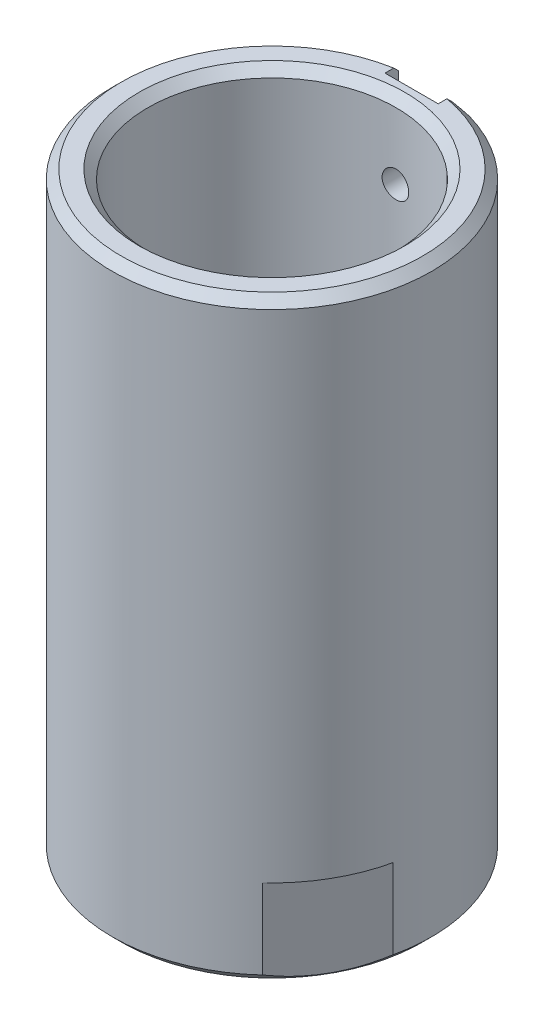
ISO-10303-21;
HEADER;
FILE_DESCRIPTION(('STEP AP214'),'2;1');
FILE_NAME('part.step','',(''),(''),'','','');
FILE_SCHEMA(('AUTOMOTIVE_DESIGN { 1 0 10303 214 1 1 1 1 }'));
ENDSEC;
DATA;
#1=APPLICATION_CONTEXT('core data for automotive mechanical design processes');
#2=APPLICATION_PROTOCOL_DEFINITION('international standard','automotive_design',2000,#1);
#3=PRODUCT_CONTEXT('',#1,'mechanical');
#4=PRODUCT('Part','Part','',(#3));
#5=PRODUCT_RELATED_PRODUCT_CATEGORY('part','',(#4));
#6=PRODUCT_DEFINITION_FORMATION('','',#4);
#7=PRODUCT_DEFINITION_CONTEXT('part definition',#1,'design');
#8=PRODUCT_DEFINITION('design','',#6,#7);
#9=PRODUCT_DEFINITION_SHAPE('','',#8);
#10=(LENGTH_UNIT() NAMED_UNIT(*) SI_UNIT(.MILLI.,.METRE.));
#11=(NAMED_UNIT(*) PLANE_ANGLE_UNIT() SI_UNIT($,.RADIAN.));
#12=(NAMED_UNIT(*) SI_UNIT($,.STERADIAN.) SOLID_ANGLE_UNIT());
#13=UNCERTAINTY_MEASURE_WITH_UNIT(LENGTH_MEASURE(1.E-05),#10,'distance_accuracy_value','');
#14=(GEOMETRIC_REPRESENTATION_CONTEXT(3) GLOBAL_UNCERTAINTY_ASSIGNED_CONTEXT((#13)) GLOBAL_UNIT_ASSIGNED_CONTEXT((#10,
#11,#12)) REPRESENTATION_CONTEXT('',''));
#15=CARTESIAN_POINT('',(0.,0.,0.));
#16=DIRECTION('',(0.,0.,1.));
#17=DIRECTION('',(1.,0.,0.));
#18=AXIS2_PLACEMENT_3D('',#15,#16,#17);
#19=CARTESIAN_POINT('',(0.,33.5,0.));
#20=DIRECTION('',(0.,-1.,0.));
#21=DIRECTION('',(0.,0.,-1.));
#22=AXIS2_PLACEMENT_3D('',#19,#20,#21);
#23=CYLINDRICAL_SURFACE('',#22,7.);
#24=CARTESIAN_POINT('',(0.,0.5,0.));
#25=DIRECTION('',(0.,1.,0.));
#26=DIRECTION('',(0.,0.,1.));
#27=AXIS2_PLACEMENT_3D('',#24,#25,#26);
#28=CIRCLE('',#27,7.);
#29=CARTESIAN_POINT('',(0.,0.5,7.));
#30=VERTEX_POINT('',#29);
#31=EDGE_CURVE('E11',#30,#30,#28,.F.);
#32=ORIENTED_EDGE('',*,*,#31,.T.);
#33=EDGE_LOOP('',(#32));
#34=FACE_BOUND('',#33,.T.);
#35=CARTESIAN_POINT('',(0.,33.,0.));
#36=DIRECTION('',(0.,1.,0.));
#37=DIRECTION('',(0.,0.,1.));
#38=AXIS2_PLACEMENT_3D('',#35,#36,#37);
#39=CIRCLE('',#38,7.);
#40=CARTESIAN_POINT('',(0.,33.,7.));
#41=VERTEX_POINT('',#40);
#42=EDGE_CURVE('E511',#41,#41,#39,.T.);
#43=ORIENTED_EDGE('',*,*,#42,.T.);
#44=EDGE_LOOP('',(#43));
#45=FACE_BOUND('',#44,.T.);
#46=CARTESIAN_POINT('',(-0.750000000000001,29.25,-6.95970545353753));
#47=CARTESIAN_POINT('',(-0.749998188954248,29.2919979041359,-6.95970597860892));
#48=CARTESIAN_POINT('',(-0.746460465229947,29.3340231781121,-6.96008970314285));
#49=CARTESIAN_POINT('',(-0.732401884499363,29.4169074031208,-6.96158283156598));
#50=CARTESIAN_POINT('',(-0.721873436693954,29.4577650359268,-6.96269302426344));
#51=CARTESIAN_POINT('',(-0.694144521638661,29.5371017574607,-6.96551192623545));
#52=CARTESIAN_POINT('',(-0.676948226374381,29.5755823160738,-6.96722026119542));
#53=CARTESIAN_POINT('',(-0.636380026781787,29.649103063514,-6.97104250359877));
#54=CARTESIAN_POINT('',(-0.61300930385036,29.6841439087284,-6.97315633343478));
#55=CARTESIAN_POINT('',(-0.560651516289507,29.7499440435217,-6.97756122064666));
#56=CARTESIAN_POINT('',(-0.531644005513801,29.780687023625,-6.97985290439945));
#57=CARTESIAN_POINT('',(-0.468879862660795,29.8368781821779,-6.98434961455859));
#58=CARTESIAN_POINT('',(-0.435123008538541,29.8623261129314,-6.98655463690711));
#59=CARTESIAN_POINT('',(-0.36371768837328,29.9072618323478,-6.99063583682212));
#60=CARTESIAN_POINT('',(-0.326060025221558,29.9267350857939,-6.99251120775583));
#61=CARTESIAN_POINT('',(-0.24798576688226,29.9590756619544,-6.99571496388661));
#62=CARTESIAN_POINT('',(-0.207569248194761,29.9719431677549,-6.99704336424341));
#63=CARTESIAN_POINT('',(-0.125290011100524,29.990658876596,-6.99899910301927));
#64=CARTESIAN_POINT('',(-0.0834334752072009,29.9965339745234,-6.99962912695603));
#65=CARTESIAN_POINT('',(0.000675925573989573,30.0011813482214,-7.00012627047899));
#66=CARTESIAN_POINT('',(0.0429287787469273,29.999953833285,-6.99999341254507));
#67=CARTESIAN_POINT('',(0.126448727987235,29.9904525841851,-6.99898195296535));
#68=CARTESIAN_POINT('',(0.167719156381502,29.982207771119,-6.99810641226255));
#69=CARTESIAN_POINT('',(0.248287115800397,29.9589510617331,-6.99571146499121));
#70=CARTESIAN_POINT('',(0.287584617971626,29.9439390664775,-6.99419204900929));
#71=CARTESIAN_POINT('',(0.3631819480879,29.907542669899,-6.99067487523425));
#72=CARTESIAN_POINT('',(0.399475604124605,29.8861455450597,-6.98867616393591));
#73=CARTESIAN_POINT('',(0.467967657190985,29.8375955175866,-6.98442450088663));
#74=CARTESIAN_POINT('',(0.500165916179861,29.8104424210222,-6.98217154057073));
#75=CARTESIAN_POINT('',(0.559722717920771,29.7509887482116,-6.97765066911835));
#76=CARTESIAN_POINT('',(0.587056137708157,29.7186630006095,-6.97538273972832));
#77=CARTESIAN_POINT('',(0.635912666329555,29.6498686938903,-6.9710987988514));
#78=CARTESIAN_POINT('',(0.657435764553122,29.613400127208,-6.96908278782456));
#79=CARTESIAN_POINT('',(0.694060974626845,29.537335275289,-6.96553082593988));
#80=CARTESIAN_POINT('',(0.70916141360807,29.4977381783647,-6.9639950001804));
#81=CARTESIAN_POINT('',(0.732492150200906,29.4165503707976,-6.96157985347851));
#82=CARTESIAN_POINT('',(0.740722688852523,29.3749597301552,-6.96070050950265));
#83=CARTESIAN_POINT('',(0.750047422819167,29.2911863431268,-6.95970194411217));
#84=CARTESIAN_POINT('',(0.751176819948078,29.249007557926,-6.95957897326707));
#85=CARTESIAN_POINT('',(0.746359773218079,29.1650613526495,-6.9600971779777));
#86=CARTESIAN_POINT('',(0.74041343940178,29.1232939261867,-6.96073834164951));
#87=CARTESIAN_POINT('',(0.721643227017531,29.041459427122,-6.96270915923294));
#88=CARTESIAN_POINT('',(0.708836098549062,29.0013884687393,-6.96403713607158));
#89=CARTESIAN_POINT('',(0.676724981403666,28.9239633834986,-6.96723059145024));
#90=CARTESIAN_POINT('',(0.657420822683684,28.8866093277797,-6.96909608405817));
#91=CARTESIAN_POINT('',(0.612775866425896,28.8155182527604,-6.97316343023226));
#92=CARTESIAN_POINT('',(0.587411805801567,28.7817959172283,-6.97536656798713));
#93=CARTESIAN_POINT('',(0.531400260034387,28.7190746810697,-6.97985681117932));
#94=CARTESIAN_POINT('',(0.500752624575668,28.6900759148728,-6.98214391900411));
#95=CARTESIAN_POINT('',(0.434890907409626,28.6375029958028,-6.98655577647023));
#96=CARTESIAN_POINT('',(0.399658405177615,28.6139518513553,-6.98867981303623));
#97=CARTESIAN_POINT('',(0.325717687806027,28.5731012633023,-6.99251575545415));
#98=CARTESIAN_POINT('',(0.287009526368538,28.5558017231245,-6.99422766767225));
#99=CARTESIAN_POINT('',(0.207295567840504,28.5279841400164,-6.99704327123349));
#100=CARTESIAN_POINT('',(0.166294610181288,28.5174523589679,-6.99814819405997));
#101=CARTESIAN_POINT('',(0.0830938249674433,28.5034244519696,-6.9996303942933));
#102=CARTESIAN_POINT('',(0.0408940364943885,28.499928096933,-7.00000769539287));
#103=CARTESIAN_POINT('',(-0.043280877437141,28.5000737874612,-6.99999210266533));
#104=CARTESIAN_POINT('',(-0.0852560698495304,28.5036801793169,-6.99960305567955));
#105=CARTESIAN_POINT('',(-0.168000531751268,28.5178540301605,-6.99810608166936));
#106=CARTESIAN_POINT('',(-0.208769800700631,28.5284214922654,-6.99699815432306));
#107=CARTESIAN_POINT('',(-0.287943667160063,28.5562072734386,-6.99418748987409));
#108=CARTESIAN_POINT('',(-0.326348698129789,28.5734243691265,-6.99248486218816));
#109=CARTESIAN_POINT('',(-0.399729595385497,28.6140169420195,-6.98867425687213));
#110=CARTESIAN_POINT('',(-0.43470546547284,28.6373924123976,-6.98656627969138));
#111=CARTESIAN_POINT('',(-0.500417838535548,28.6897715174072,-6.98216825318622));
#112=CARTESIAN_POINT('',(-0.531133112197557,28.7188017166406,-6.97987737584868));
#113=CARTESIAN_POINT('',(-0.587271454076921,28.7816127561913,-6.97537866721102));
#114=CARTESIAN_POINT('',(-0.612693255454977,28.8153947304746,-6.97317085589368));
#115=CARTESIAN_POINT('',(-0.657582396293361,28.8868585760036,-6.96908146510482));
#116=CARTESIAN_POINT('',(-0.677032379556264,28.9245513966185,-6.96720084329839));
#117=CARTESIAN_POINT('',(-0.709300514000938,29.0026649489938,-6.96399010067246));
#118=CARTESIAN_POINT('',(-0.722126075368956,29.0430825752524,-6.9626593650761));
#119=CARTESIAN_POINT('',(-0.737616363484706,29.1114367554021,-6.961031400962));
#120=CARTESIAN_POINT('',(-0.742253794730779,29.1389377265766,-6.9605365545351));
#121=CARTESIAN_POINT('',(-0.748446205999602,29.1942884510694,-6.95987340747221));
#122=CARTESIAN_POINT('',(-0.750001201464475,29.2221382026397,-6.95970510520032));
#123=CARTESIAN_POINT('',(-0.750000000000001,29.25,-6.95970545353753));
#124=B_SPLINE_CURVE_WITH_KNOTS('',3,(#46,#47,#48,#49,#50,#51,#52,#53,#54,#55,#56,#57,#58,#59,
#60,#61,#62,#63,#64,#65,#66,#67,#68,#69,#70,#71,#72,#73,#74,#75,#76,#77,#78,#79,#80,#81,#82,#83,
#84,#85,#86,#87,#88,#89,#90,#91,#92,#93,#94,#95,#96,#97,#98,#99,#100,#101,#102,#103,#104,#105,
#106,#107,#108,#109,#110,#111,#112,#113,#114,#115,#116,#117,#118,#119,#120,#121,#122,#123),
.UNSPECIFIED.,.T.,.F.,(4,2,2,2,2,2,2,2,2,2,2,2,2,2,2,2,2,2,2,2,2,2,2,2,2,2,2,2,2,2,2,2,2,2,2,2,
2,2,4),(0.,0.125891956665267,0.251920835733632,0.377870987081191,0.503797056927248,
0.630188720738995,0.756586295675875,0.883288976463161,1.00998814534838,1.13619840010579,
1.26240493583866,1.38809382867333,1.51378455913157,1.63972744269348,1.76567457020331,
1.89225434698756,2.0188343549223,2.14544731218131,2.27205582686193,2.39803621910148,
2.52401465210455,2.64968691094277,2.77536245918493,2.90152843695946,3.02769800470471,
3.1543911059818,3.28108225007225,3.40751539999475,3.53394443294853,3.65974044657153,
3.78553651652238,3.91130945389492,4.03708225184162,4.16346080720354,4.28986957293918,
4.41664232316294,4.54327295451181,4.6267912592976,4.71030914567944),.UNSPECIFIED.);
#125=CARTESIAN_POINT('',(-0.750000000000001,29.25,-6.95970545353753));
#126=VERTEX_POINT('',#125);
#127=EDGE_CURVE('E138',#126,#126,#124,.T.);
#128=ORIENTED_EDGE('',*,*,#127,.T.);
#129=EDGE_LOOP('',(#128));
#130=FACE_BOUND('',#129,.T.);
#131=CARTESIAN_POINT('',(-5.5,2.5,4.33012701892219));
#132=CARTESIAN_POINT('',(-5.50000194275706,2.44413791438435,4.33012545079125));
#133=CARTESIAN_POINT('',(-5.50293977358478,2.38824264362741,4.32640104199753));
#134=CARTESIAN_POINT('',(-5.51456200770678,2.278012681801,4.31157641361144));
#135=CARTESIAN_POINT('',(-5.52325213760261,2.22367960224494,4.30046884379515));
#136=CARTESIAN_POINT('',(-5.54596945799242,2.11818564998112,4.27113154765873));
#137=CARTESIAN_POINT('',(-5.55999269664827,2.06702246094855,4.2529070946873));
#138=CARTESIAN_POINT('',(-5.5927485085935,1.96925513526716,4.20973809522395));
#139=CARTESIAN_POINT('',(-5.61148038613033,1.92265032648017,4.18479454151317));
#140=CARTESIAN_POINT('',(-5.65299474427765,1.83497585207601,4.12854414052465));
#141=CARTESIAN_POINT('',(-5.67580276804278,1.79394414306697,4.0971969767312));
#142=CARTESIAN_POINT('',(-5.72445759580941,1.71890922137979,4.02893762947487));
#143=CARTESIAN_POINT('',(-5.75030456181793,1.68490638367988,3.99202514929349));
#144=CARTESIAN_POINT('',(-5.80415549414252,1.62475545112013,3.91331815934242));
#145=CARTESIAN_POINT('',(-5.83216834837752,1.59864214274078,3.87150312524937));
#146=CARTESIAN_POINT('',(-5.88921637392223,1.55523463233609,3.78415753812966));
#147=CARTESIAN_POINT('',(-5.91825149605228,1.5379400066763,3.73862716370351));
#148=CARTESIAN_POINT('',(-5.97613903078911,1.51277539651786,3.64537406566751));
#149=CARTESIAN_POINT('',(-6.00499133955338,1.50484196501688,3.59766840406352));
#150=CARTESIAN_POINT('',(-6.06179940530634,1.4984280507167,3.50110339955694));
#151=CARTESIAN_POINT('',(-6.08975520764356,1.49994708901694,3.45224411522651));
#152=CARTESIAN_POINT('',(-6.14378230791832,1.51234468910791,3.35514598667531));
#153=CARTESIAN_POINT('',(-6.16986584872934,1.52315499944125,3.30690521544099));
#154=CARTESIAN_POINT('',(-6.21974643087186,1.5537212798496,3.2121060256611));
#155=CARTESIAN_POINT('',(-6.24354341785463,1.5734774624939,3.16554764712046));
#156=CARTESIAN_POINT('',(-6.28845921450289,1.62144537239178,3.07535854286614));
#157=CARTESIAN_POINT('',(-6.30956848773945,1.64968607555942,3.03173848711685));
#158=CARTESIAN_POINT('',(-6.34868751016331,1.71380024637013,2.94894333798147));
#159=CARTESIAN_POINT('',(-6.36669707393575,1.74967417032161,2.90976851054267));
#160=CARTESIAN_POINT('',(-6.3995577498915,1.82841730083799,2.8367728806548));
#161=CARTESIAN_POINT('',(-6.41437924729288,1.87134606637459,2.80300296778562));
#162=CARTESIAN_POINT('',(-6.44053937358176,1.96277726071474,2.7423615155652));
#163=CARTESIAN_POINT('',(-6.45187798462503,2.01127971807281,2.71549001155741));
#164=CARTESIAN_POINT('',(-6.4710195291785,2.11254014495309,2.66955593552164));
#165=CARTESIAN_POINT('',(-6.47882012339291,2.1653009029413,2.65049853088248));
#166=CARTESIAN_POINT('',(-6.49084820744127,2.27354878991294,2.62090577858383));
#167=CARTESIAN_POINT('',(-6.49507592461071,2.32903574519578,2.61036988871811));
#168=CARTESIAN_POINT('',(-6.49992840678571,2.44063826871502,2.59826356146011));
#169=CARTESIAN_POINT('',(-6.50058453993285,2.49674401299779,2.59661506997062));
#170=CARTESIAN_POINT('',(-6.49837710210849,2.60844890251257,2.60213441773304));
#171=CARTESIAN_POINT('',(-6.49551362987185,2.66404806191164,2.60930200966892));
#172=CARTESIAN_POINT('',(-6.48629350426331,2.77290609001422,2.63213706306361));
#173=CARTESIAN_POINT('',(-6.47995262702475,2.82617436353267,2.64776613280622));
#174=CARTESIAN_POINT('',(-6.46380550144923,2.92915439872825,2.68694337336841));
#175=CARTESIAN_POINT('',(-6.45399909672264,2.97886599978086,2.71049190156885));
#176=CARTESIAN_POINT('',(-6.43088330929899,3.07369593986074,2.76488985488164));
#177=CARTESIAN_POINT('',(-6.4175503901659,3.11878048060618,2.79578818862222));
#178=CARTESIAN_POINT('',(-6.38750224044282,3.20272986181275,2.86377249475225));
#179=CARTESIAN_POINT('',(-6.37078683688862,3.24159438402956,2.90085878354735));
#180=CARTESIAN_POINT('',(-6.33400032440684,3.3122976092169,2.9803301471087));
#181=CARTESIAN_POINT('',(-6.31390491806205,3.34408126115976,3.02275298337605));
#182=CARTESIAN_POINT('',(-6.27072976339902,3.39933778156786,3.11132966485657));
#183=CARTESIAN_POINT('',(-6.24765009045142,3.42281085986897,3.15748341583073));
#184=CARTESIAN_POINT('',(-6.19901542615673,3.46069105715786,3.25192510343772));
#185=CARTESIAN_POINT('',(-6.17346913698096,3.47512879431374,3.3002052323628));
#186=CARTESIAN_POINT('',(-6.12042039261016,3.4946277335533,3.39757650748381));
#187=CARTESIAN_POINT('',(-6.09291805419781,3.49968949492692,3.44666760512805));
#188=CARTESIAN_POINT('',(-6.03695171807081,3.50028011947223,3.5437729781803));
#189=CARTESIAN_POINT('',(-6.00849845528105,3.49589340950922,3.59179294847806));
#190=CARTESIAN_POINT('',(-5.95125678692636,3.47789192497848,3.68586151890487));
#191=CARTESIAN_POINT('',(-5.92246838215287,3.46427717219806,3.73191012368802));
#192=CARTESIAN_POINT('',(-5.86552121751137,3.4282350112859,3.82079145893961));
#193=CARTESIAN_POINT('',(-5.83736208926935,3.40581290975763,3.86362610740575));
#194=CARTESIAN_POINT('',(-5.78264436844424,3.35280142539899,3.94505175277544));
#195=CARTESIAN_POINT('',(-5.75608581803626,3.32221182747094,3.98364263787823));
#196=CARTESIAN_POINT('',(-5.70534044620681,3.25342614238831,4.05599094732681));
#197=CARTESIAN_POINT('',(-5.68117572867416,3.21516754658375,4.08970444979993));
#198=CARTESIAN_POINT('',(-5.63643532647144,3.13226121988235,4.1511498752371));
#199=CARTESIAN_POINT('',(-5.61586048720839,3.08761198850172,4.17888038958571));
#200=CARTESIAN_POINT('',(-5.57907864510288,2.99292728083219,4.22786320577816));
#201=CARTESIAN_POINT('',(-5.56289430603893,2.94286565479448,4.24908196508331));
#202=CARTESIAN_POINT('',(-5.53577064178122,2.83898385169769,4.28436027074053));
#203=CARTESIAN_POINT('',(-5.52482579408387,2.78516770084123,4.29842735603999));
#204=CARTESIAN_POINT('',(-5.51120534534633,2.69258178708485,4.31586525310683));
#205=CARTESIAN_POINT('',(-5.50701274353545,2.6543878322951,4.32120717020786));
#206=CARTESIAN_POINT('',(-5.50140941272048,2.5774679015167,4.32833857704697));
#207=CARTESIAN_POINT('',(-5.49999865264321,2.53874193147553,4.33012810646522));
#208=CARTESIAN_POINT('',(-5.5,2.5,4.33012701892219));
#209=B_SPLINE_CURVE_WITH_KNOTS('',3,(#131,#132,#133,#134,#135,#136,#137,#138,#139,#140,#141,
#142,#143,#144,#145,#146,#147,#148,#149,#150,#151,#152,#153,#154,#155,#156,#157,#158,#159,#160,
#161,#162,#163,#164,#165,#166,#167,#168,#169,#170,#171,#172,#173,#174,#175,#176,#177,#178,#179,
#180,#181,#182,#183,#184,#185,#186,#187,#188,#189,#190,#191,#192,#193,#194,#195,#196,#197,#198,
#199,#200,#201,#202,#203,#204,#205,#206,#207,#208),.UNSPECIFIED.,.T.,.F.,(4,2,2,2,2,2,2,2,2,2,2,
2,2,2,2,2,2,2,2,2,2,2,2,2,2,2,2,2,2,2,2,2,2,2,2,2,2,2,4),(0.,0.167444674697946,0.33505629725044,
0.502543960684092,0.670006890528837,0.838558578232397,1.00711925555999,1.17641265336732,
1.3456979178424,1.51382911068039,1.6819517853778,1.84884992452451,2.01575202966586,
2.18323073819423,2.3507194612925,2.51970258991851,2.68868658429869,2.85778214664265,
3.02686694894168,3.1944643054001,3.36205696038683,3.52889550400879,3.69574157755292,
3.86373060504461,4.0317282248703,4.20098960759813,4.37024671629559,4.53892711068184,
4.70759744272481,4.87476687650763,5.0419359156068,5.20900438614292,5.37607725699724,
5.54457174653061,5.71310586267878,5.88249407755997,6.05170335943179,6.1678322598134,
6.28395986302758),.UNSPECIFIED.);
#210=CARTESIAN_POINT('',(-5.5,2.5,4.33012701892219));
#211=VERTEX_POINT('',#210);
#212=EDGE_CURVE('E184',#211,#211,#209,.T.);
#213=ORIENTED_EDGE('',*,*,#212,.F.);
#214=EDGE_LOOP('',(#213));
#215=FACE_BOUND('',#214,.T.);
#216=ADVANCED_FACE('F33',(#34,#45,#130,#215),#23,.F.);
#217=CARTESIAN_POINT('',(0.,33.5,0.));
#218=DIRECTION('',(0.,1.,0.));
#219=DIRECTION('',(0.,0.,1.));
#220=AXIS2_PLACEMENT_3D('',#217,#218,#219);
#221=PLANE('',#220);
#222=CARTESIAN_POINT('',(0.,33.5,0.));
#223=DIRECTION('',(0.,1.,0.));
#224=DIRECTION('',(0.,0.,1.));
#225=AXIS2_PLACEMENT_3D('',#222,#223,#224);
#226=CIRCLE('',#225,7.50000000000001);
#227=CARTESIAN_POINT('',(0.,33.5,7.50000000000001));
#228=VERTEX_POINT('',#227);
#229=EDGE_CURVE('E219',#228,#228,#226,.F.);
#230=ORIENTED_EDGE('',*,*,#229,.T.);
#231=EDGE_LOOP('',(#230));
#232=FACE_BOUND('',#231,.T.);
#233=DIRECTION('',(0.,0.,1.));
#234=VECTOR('',#233,1.);
#235=CARTESIAN_POINT('',(-1.5,33.5,-8.87411967464942));
#236=LINE('',#235,#234);
#237=CARTESIAN_POINT('',(-1.5,33.5,-8.36660026534075));
#238=VERTEX_POINT('',#237);
#239=CARTESIAN_POINT('',(-1.5,33.5,-7.87411967464942));
#240=VERTEX_POINT('',#239);
#241=EDGE_CURVE('E173',#238,#240,#236,.T.);
#242=ORIENTED_EDGE('',*,*,#241,.F.);
#243=CARTESIAN_POINT('',(0.,33.5,0.));
#244=DIRECTION('',(0.,1.,0.));
#245=DIRECTION('',(0.,0.,1.));
#246=AXIS2_PLACEMENT_3D('',#243,#244,#245);
#247=CIRCLE('',#246,8.5);
#248=CARTESIAN_POINT('',(1.5,33.5,-8.36660026534075));
#249=VERTEX_POINT('',#248);
#250=EDGE_CURVE('E524',#238,#249,#247,.T.);
#251=ORIENTED_EDGE('',*,*,#250,.T.);
#252=DIRECTION('',(0.,0.,-1.));
#253=VECTOR('',#252,1.);
#254=CARTESIAN_POINT('',(1.5,33.5,-8.87411967464942));
#255=LINE('',#254,#253);
#256=CARTESIAN_POINT('',(1.5,33.5,-7.87411967464942));
#257=VERTEX_POINT('',#256);
#258=EDGE_CURVE('E160',#257,#249,#255,.T.);
#259=ORIENTED_EDGE('',*,*,#258,.F.);
#260=DIRECTION('',(1.,0.,0.));
#261=VECTOR('',#260,1.);
#262=CARTESIAN_POINT('',(-1.5,33.5,-7.87411967464942));
#263=LINE('',#262,#261);
#264=EDGE_CURVE('E165',#240,#257,#263,.T.);
#265=ORIENTED_EDGE('',*,*,#264,.F.);
#266=EDGE_LOOP('',(#242,#251,#259,#265));
#267=FACE_BOUND('',#266,.T.);
#268=ADVANCED_FACE('F267',(#232,#267),#221,.T.);
#269=CARTESIAN_POINT('',(0.,0.,0.));
#270=DIRECTION('',(0.,1.,0.));
#271=DIRECTION('',(0.,0.,1.));
#272=AXIS2_PLACEMENT_3D('',#269,#270,#271);
#273=PLANE('',#272);
#274=CARTESIAN_POINT('',(0.,0.,0.));
#275=DIRECTION('',(0.,1.,0.));
#276=DIRECTION('',(0.,0.,1.));
#277=AXIS2_PLACEMENT_3D('',#274,#275,#276);
#278=CIRCLE('',#277,7.5);
#279=CARTESIAN_POINT('',(0.,0.,7.5));
#280=VERTEX_POINT('',#279);
#281=EDGE_CURVE('E41',#280,#280,#278,.T.);
#282=ORIENTED_EDGE('',*,*,#281,.T.);
#283=EDGE_LOOP('',(#282));
#284=FACE_BOUND('',#283,.T.);
#285=CARTESIAN_POINT('',(0.,0.,0.));
#286=DIRECTION('',(0.,1.,0.));
#287=DIRECTION('',(0.,0.,1.));
#288=AXIS2_PLACEMENT_3D('',#285,#286,#287);
#289=CIRCLE('',#288,8.5);
#290=CARTESIAN_POINT('',(8.29715244778978,0.,1.8458768263717));
#291=VERTEX_POINT('',#290);
#292=EDGE_CURVE('E46',#291,#291,#289,.F.);
#293=ORIENTED_EDGE('',*,*,#292,.T.);
#294=EDGE_LOOP('',(#293));
#295=FACE_BOUND('',#294,.T.);
#296=ADVANCED_FACE('F275',(#284,#295),#273,.F.);
#297=CARTESIAN_POINT('',(0.,33.5,0.));
#298=DIRECTION('',(0.,-1.,0.));
#299=DIRECTION('',(0.,0.,-1.));
#300=AXIS2_PLACEMENT_3D('',#297,#298,#299);
#301=CYLINDRICAL_SURFACE('',#300,9.);
#302=DIRECTION('',(0.,1.,0.));
#303=VECTOR('',#302,1.);
#304=CARTESIAN_POINT('',(2.5,28.,-8.64580823289529));
#305=LINE('',#304,#303);
#306=CARTESIAN_POINT('',(2.5,28.,-8.64580823289529));
#307=VERTEX_POINT('',#306);
#308=CARTESIAN_POINT('',(2.5,33.,-8.64580823289529));
#309=VERTEX_POINT('',#308);
#310=EDGE_CURVE('E146',#307,#309,#305,.T.);
#311=ORIENTED_EDGE('',*,*,#310,.T.);
#312=CARTESIAN_POINT('',(0.,33.,0.));
#313=DIRECTION('',(0.,1.,0.));
#314=DIRECTION('',(0.,0.,1.));
#315=AXIS2_PLACEMENT_3D('',#312,#313,#314);
#316=CIRCLE('',#315,9.);
#317=CARTESIAN_POINT('',(-2.5,33.,-8.64580823289529));
#318=VERTEX_POINT('',#317);
#319=EDGE_CURVE('E151',#309,#318,#316,.F.);
#320=ORIENTED_EDGE('',*,*,#319,.T.);
#321=DIRECTION('',(0.,1.,0.));
#322=VECTOR('',#321,1.);
#323=CARTESIAN_POINT('',(-2.5,28.,-8.64580823289529));
#324=LINE('',#323,#322);
#325=CARTESIAN_POINT('',(-2.5,28.,-8.64580823289529));
#326=VERTEX_POINT('',#325);
#327=EDGE_CURVE('E144',#326,#318,#324,.T.);
#328=ORIENTED_EDGE('',*,*,#327,.F.);
#329=CARTESIAN_POINT('',(0.,28.,0.));
#330=DIRECTION('',(0.,1.,0.));
#331=DIRECTION('',(0.,0.,1.));
#332=AXIS2_PLACEMENT_3D('',#329,#330,#331);
#333=CIRCLE('',#332,9.);
#334=EDGE_CURVE('E131',#307,#326,#333,.T.);
#335=ORIENTED_EDGE('',*,*,#334,.F.);
#336=EDGE_LOOP('',(#311,#320,#328,#335));
#337=FACE_BOUND('',#336,.T.);
#338=DIRECTION('',(0.,-1.,0.));
#339=VECTOR('',#338,1.);
#340=CARTESIAN_POINT('',(8.78522023883624,5.,1.95445781615828));
#341=LINE('',#340,#339);
#342=CARTESIAN_POINT('',(8.78522023883624,5.,1.95445781615828));
#343=VERTEX_POINT('',#342);
#344=CARTESIAN_POINT('',(8.78522023883624,0.499999999999973,1.95445781615828));
#345=VERTEX_POINT('',#344);
#346=EDGE_CURVE('E307',#343,#345,#341,.T.);
#347=ORIENTED_EDGE('',*,*,#346,.T.);
#348=CARTESIAN_POINT('',(0.,0.5,0.));
#349=DIRECTION('',(0.,1.,0.));
#350=DIRECTION('',(0.,0.,1.));
#351=AXIS2_PLACEMENT_3D('',#348,#349,#350);
#352=CIRCLE('',#351,9.);
#353=CARTESIAN_POINT('',(2.7,0.500000000000002,-8.58545281275251));
#354=VERTEX_POINT('',#353);
#355=EDGE_CURVE('E311',#345,#354,#352,.T.);
#356=ORIENTED_EDGE('',*,*,#355,.T.);
#357=DIRECTION('',(0.,-1.,0.));
#358=VECTOR('',#357,1.);
#359=CARTESIAN_POINT('',(2.7,5.,-8.58545281275251));
#360=LINE('',#359,#358);
#361=CARTESIAN_POINT('',(2.7,5.,-8.58545281275251));
#362=VERTEX_POINT('',#361);
#363=EDGE_CURVE('E507',#362,#354,#360,.T.);
#364=ORIENTED_EDGE('',*,*,#363,.F.);
#365=CARTESIAN_POINT('',(0.,5.,0.));
#366=DIRECTION('',(0.,-1.,0.));
#367=DIRECTION('',(0.,0.,-1.));
#368=AXIS2_PLACEMENT_3D('',#365,#366,#367);
#369=CIRCLE('',#368,9.);
#370=CARTESIAN_POINT('',(-2.7,5.,-8.58545281275251));
#371=VERTEX_POINT('',#370);
#372=EDGE_CURVE('E193',#371,#362,#369,.T.);
#373=ORIENTED_EDGE('',*,*,#372,.F.);
#374=DIRECTION('',(0.,-1.,0.));
#375=VECTOR('',#374,1.);
#376=CARTESIAN_POINT('',(-2.7,5.,-8.58545281275251));
#377=LINE('',#376,#375);
#378=CARTESIAN_POINT('',(-2.7,0.500000000000002,-8.58545281275251));
#379=VERTEX_POINT('',#378);
#380=EDGE_CURVE('E504',#371,#379,#377,.T.);
#381=ORIENTED_EDGE('',*,*,#380,.T.);
#382=CARTESIAN_POINT('',(0.,0.5,0.));
#383=DIRECTION('',(0.,1.,0.));
#384=DIRECTION('',(0.,0.,1.));
#385=AXIS2_PLACEMENT_3D('',#382,#383,#384);
#386=CIRCLE('',#385,9.);
#387=CARTESIAN_POINT('',(-8.78522023883624,0.500000000000002,1.95445781615827));
#388=VERTEX_POINT('',#387);
#389=EDGE_CURVE('E486',#379,#388,#386,.T.);
#390=ORIENTED_EDGE('',*,*,#389,.T.);
#391=DIRECTION('',(0.,-1.,0.));
#392=VECTOR('',#391,1.);
#393=CARTESIAN_POINT('',(-8.78522023883624,5.,1.95445781615827));
#394=LINE('',#393,#392);
#395=CARTESIAN_POINT('',(-8.78522023883624,5.,1.95445781615827));
#396=VERTEX_POINT('',#395);
#397=EDGE_CURVE('E479',#396,#388,#394,.T.);
#398=ORIENTED_EDGE('',*,*,#397,.F.);
#399=CARTESIAN_POINT('',(0.,5.,0.));
#400=DIRECTION('',(0.,-1.,0.));
#401=DIRECTION('',(0.,0.,-1.));
#402=AXIS2_PLACEMENT_3D('',#399,#400,#401);
#403=CIRCLE('',#402,9.);
#404=CARTESIAN_POINT('',(-6.08522023883624,5.,6.63099499659424));
#405=VERTEX_POINT('',#404);
#406=EDGE_CURVE('E516',#405,#396,#403,.T.);
#407=ORIENTED_EDGE('',*,*,#406,.F.);
#408=DIRECTION('',(0.,-1.,0.));
#409=VECTOR('',#408,1.);
#410=CARTESIAN_POINT('',(-6.08522023883624,5.,6.63099499659424));
#411=LINE('',#410,#409);
#412=CARTESIAN_POINT('',(-6.08522023883624,0.500000000000002,6.63099499659424));
#413=VERTEX_POINT('',#412);
#414=EDGE_CURVE('E484',#405,#413,#411,.T.);
#415=ORIENTED_EDGE('',*,*,#414,.T.);
#416=CARTESIAN_POINT('',(0.,0.5,0.));
#417=DIRECTION('',(0.,1.,0.));
#418=DIRECTION('',(0.,0.,1.));
#419=AXIS2_PLACEMENT_3D('',#416,#417,#418);
#420=CIRCLE('',#419,9.);
#421=CARTESIAN_POINT('',(6.08522023883624,0.500000000000002,6.63099499659424));
#422=VERTEX_POINT('',#421);
#423=EDGE_CURVE('E246',#413,#422,#420,.T.);
#424=ORIENTED_EDGE('',*,*,#423,.T.);
#425=DIRECTION('',(0.,-1.,0.));
#426=VECTOR('',#425,1.);
#427=CARTESIAN_POINT('',(6.08522023883624,5.,6.63099499659424));
#428=LINE('',#427,#426);
#429=CARTESIAN_POINT('',(6.08522023883624,5.,6.63099499659424));
#430=VERTEX_POINT('',#429);
#431=EDGE_CURVE('E300',#430,#422,#428,.T.);
#432=ORIENTED_EDGE('',*,*,#431,.F.);
#433=CARTESIAN_POINT('',(0.,5.,0.));
#434=DIRECTION('',(0.,-1.,0.));
#435=DIRECTION('',(0.,0.,-1.));
#436=AXIS2_PLACEMENT_3D('',#433,#434,#435);
#437=CIRCLE('',#436,9.);
#438=EDGE_CURVE('E192',#343,#430,#437,.T.);
#439=ORIENTED_EDGE('',*,*,#438,.F.);
#440=EDGE_LOOP('',(#347,#356,#364,#373,#381,#390,#398,#407,#415,#424,#432,#439));
#441=FACE_BOUND('',#440,.T.);
#442=ADVANCED_FACE('F148',(#337,#441),#301,.T.);
#443=CARTESIAN_POINT('',(6.08522023883624,5.,6.63099499659424));
#444=DIRECTION('',(-0.866025403784439,0.,-0.5));
#445=DIRECTION('',(-0.5,0.,0.866025403784439));
#446=AXIS2_PLACEMENT_3D('',#443,#444,#445);
#447=PLANE('',#446);
#448=ORIENTED_EDGE('',*,*,#431,.T.);
#449=CARTESIAN_POINT('',(6.08522023883624,0.500000000000003,6.63099499659424));
#450=CARTESIAN_POINT('',(6.19290365665222,0.435335714197766,6.44448184580429));
#451=CARTESIAN_POINT('',(6.30161938476202,0.377190338559779,6.25618068113627));
#452=CARTESIAN_POINT('',(6.52085037423658,0.275479054164865,5.87646146877275));
#453=CARTESIAN_POINT('',(6.63136733881221,0.231927898204628,5.68504047102946));
#454=CARTESIAN_POINT('',(6.85111934151673,0.161911187546818,5.30441883728021));
#455=CARTESIAN_POINT('',(6.9603239909999,0.135070175921717,5.11527083595261));
#456=CARTESIAN_POINT('',(7.17938303520882,0.0979181166742025,4.73584944152528));
#457=CARTESIAN_POINT('',(7.2892370923497,0.087599128903635,4.5455766331397));
#458=CARTESIAN_POINT('',(7.53005474150031,0.0835606251285639,4.12846822945155));
#459=CARTESIAN_POINT('',(7.66103729666697,0.0933933401621818,3.9015997889977));
#460=CARTESIAN_POINT('',(7.92212038139585,0.13657656808393,3.44939062125048));
#461=CARTESIAN_POINT('',(8.05222002111248,0.16994802702266,3.22405143521486));
#462=CARTESIAN_POINT('',(8.31423608258998,0.259687570075521,2.77022630433675));
#463=CARTESIAN_POINT('',(8.44609827164077,0.316685221958203,2.54183429330353));
#464=CARTESIAN_POINT('',(8.64179238225392,0.417250392936776,2.20288215097954));
#465=CARTESIAN_POINT('',(8.70662911878005,0.453253023517721,2.09058162911933));
#466=CARTESIAN_POINT('',(8.83559581883203,0.5298982240336,1.86720475214481));
#467=CARTESIAN_POINT('',(8.89972596390934,0.570539570101741,1.75612808257415));
#468=CARTESIAN_POINT('',(8.96350019182816,0.613317642816363,1.64566787960527));
#469=B_SPLINE_CURVE_WITH_KNOTS('',3,(#449,#450,#451,#452,#453,#454,#455,#456,#457,#458,#459,
#460,#461,#462,#463,#464,#465,#466,#467,#468),.UNSPECIFIED.,.F.,.F.,(4,2,2,2,2,2,2,2,2,4),(0.,
0.674647274374241,1.3499744837022,2.00952144145169,2.66875133912638,3.45406373412177,
4.24007582570968,5.04853658555661,5.45220073277938,5.85575862340769),.UNSPECIFIED.);
#470=EDGE_CURVE('E303',#422,#345,#469,.T.);
#471=ORIENTED_EDGE('',*,*,#470,.T.);
#472=ORIENTED_EDGE('',*,*,#346,.F.);
#473=DIRECTION('',(0.5,0.,-0.866025403784438));
#474=VECTOR('',#473,1.);
#475=CARTESIAN_POINT('',(6.08522023883624,5.,6.63099499659424));
#476=LINE('',#475,#474);
#477=EDGE_CURVE('E305',#430,#343,#476,.T.);
#478=ORIENTED_EDGE('',*,*,#477,.F.);
#479=EDGE_LOOP('',(#448,#471,#472,#478));
#480=FACE_BOUND('',#479,.T.);
#481=ADVANCED_FACE('F280',(#480),#447,.F.);
#482=CARTESIAN_POINT('',(0.,5.,0.));
#483=DIRECTION('',(0.,-1.,0.));
#484=DIRECTION('',(0.,0.,-1.));
#485=AXIS2_PLACEMENT_3D('',#482,#483,#484);
#486=PLANE('',#485);
#487=ORIENTED_EDGE('',*,*,#438,.T.);
#488=ORIENTED_EDGE('',*,*,#477,.T.);
#489=EDGE_LOOP('',(#487,#488));
#490=FACE_BOUND('',#489,.T.);
#491=ADVANCED_FACE('F289',(#490),#486,.T.);
#492=CARTESIAN_POINT('',(-8.78522023883624,5.,1.95445781615827));
#493=DIRECTION('',(0.866025403784439,0.,-0.5));
#494=DIRECTION('',(-0.5,0.,-0.866025403784439));
#495=AXIS2_PLACEMENT_3D('',#492,#493,#494);
#496=PLANE('',#495);
#497=CARTESIAN_POINT('',(-7.43522023883624,2.5,4.29272640637625));
#498=DIRECTION('',(0.866025403784439,0.,-0.5));
#499=DIRECTION('',(-0.5,0.,-0.866025403784439));
#500=AXIS2_PLACEMENT_3D('',#497,#498,#499);
#501=CIRCLE('',#500,1.);
#502=CARTESIAN_POINT('',(-7.93522023883624,2.5,3.42670100259182));
#503=VERTEX_POINT('',#502);
#504=EDGE_CURVE('E179',#503,#503,#501,.T.);
#505=ORIENTED_EDGE('',*,*,#504,.T.);
#506=EDGE_LOOP('',(#505));
#507=FACE_BOUND('',#506,.T.);
#508=ORIENTED_EDGE('',*,*,#397,.T.);
#509=CARTESIAN_POINT('',(-8.78522023883624,0.500000000000002,1.95445781615827));
#510=CARTESIAN_POINT('',(-8.67753682102026,0.435335714197764,2.14097096694822));
#511=CARTESIAN_POINT('',(-8.56882109291045,0.377190338559777,2.32927213161624));
#512=CARTESIAN_POINT('',(-8.3495901034359,0.275479054164864,2.70899134397977));
#513=CARTESIAN_POINT('',(-8.23907313886027,0.231927898204628,2.90041234172305));
#514=CARTESIAN_POINT('',(-8.01932113615574,0.161911187546818,3.2810339754723));
#515=CARTESIAN_POINT('',(-7.91011648667257,0.135070175921716,3.4701819767999));
#516=CARTESIAN_POINT('',(-7.69105744246365,0.0979181166742018,3.84960337122723));
#517=CARTESIAN_POINT('',(-7.58120338532277,0.0875991289036351,4.03987617961281));
#518=CARTESIAN_POINT('',(-7.34038573617216,0.0835606251285644,4.45698458330096));
#519=CARTESIAN_POINT('',(-7.2094031810055,0.0933933401621817,4.68385302375481));
#520=CARTESIAN_POINT('',(-6.94832009627663,0.136576568083929,5.13606219150203));
#521=CARTESIAN_POINT('',(-6.81822045655999,0.16994802702266,5.36140137753765));
#522=CARTESIAN_POINT('',(-6.55620439508249,0.259687570075522,5.81522650841577));
#523=CARTESIAN_POINT('',(-6.42434220603171,0.316685221958205,6.04361851944899));
#524=CARTESIAN_POINT('',(-6.22864809541855,0.417250392936776,6.38257066177297));
#525=CARTESIAN_POINT('',(-6.16381135889243,0.453253023517721,6.49487118363318));
#526=CARTESIAN_POINT('',(-6.03484465884044,0.5298982240336,6.71824806060771));
#527=CARTESIAN_POINT('',(-5.97071451376314,0.570539570101741,6.82932473017836));
#528=CARTESIAN_POINT('',(-5.90694028584432,0.613317642816366,6.93978493314724));
#529=B_SPLINE_CURVE_WITH_KNOTS('',3,(#509,#510,#511,#512,#513,#514,#515,#516,#517,#518,#519,
#520,#521,#522,#523,#524,#525,#526,#527,#528),.UNSPECIFIED.,.F.,.F.,(4,2,2,2,2,2,2,2,2,4),(0.,
0.674647274374239,1.3499744837022,2.00952144145169,2.66875133912638,3.45406373412177,
4.24007582570968,5.04853658555661,5.45220073277938,5.8557586234077),.UNSPECIFIED.);
#530=EDGE_CURVE('E312',#388,#413,#529,.T.);
#531=ORIENTED_EDGE('',*,*,#530,.T.);
#532=ORIENTED_EDGE('',*,*,#414,.F.);
#533=DIRECTION('',(0.5,0.,0.866025403784439));
#534=VECTOR('',#533,1.);
#535=CARTESIAN_POINT('',(-8.78522023883624,5.,1.95445781615827));
#536=LINE('',#535,#534);
#537=EDGE_CURVE('E482',#396,#405,#536,.T.);
#538=ORIENTED_EDGE('',*,*,#537,.F.);
#539=EDGE_LOOP('',(#508,#531,#532,#538));
#540=FACE_BOUND('',#539,.T.);
#541=ADVANCED_FACE('F295',(#507,#540),#496,.F.);
#542=CARTESIAN_POINT('',(0.,5.,0.));
#543=DIRECTION('',(0.,-1.,0.));
#544=DIRECTION('',(0.,0.,-1.));
#545=AXIS2_PLACEMENT_3D('',#542,#543,#544);
#546=PLANE('',#545);
#547=ORIENTED_EDGE('',*,*,#406,.T.);
#548=ORIENTED_EDGE('',*,*,#537,.T.);
#549=EDGE_LOOP('',(#547,#548));
#550=FACE_BOUND('',#549,.T.);
#551=ADVANCED_FACE('F386',(#550),#546,.T.);
#552=CARTESIAN_POINT('',(2.7,5.,-8.58545281275251));
#553=DIRECTION('',(0.,0.,1.));
#554=DIRECTION('',(1.,0.,0.));
#555=AXIS2_PLACEMENT_3D('',#552,#553,#554);
#556=PLANE('',#555);
#557=ORIENTED_EDGE('',*,*,#363,.T.);
#558=CARTESIAN_POINT('',(2.7,0.500000000000002,-8.58545281275251));
#559=CARTESIAN_POINT('',(2.48463316436804,0.435335714197765,-8.58545281275251));
#560=CARTESIAN_POINT('',(2.26720170814843,0.377190338559777,-8.58545281275251));
#561=CARTESIAN_POINT('',(1.82873972919932,0.275479054164864,-8.58545281275251));
#562=CARTESIAN_POINT('',(1.60770580004806,0.231927898204628,-8.58545281275251));
#563=CARTESIAN_POINT('',(1.16820179463901,0.161911187546818,-8.58545281275251));
#564=CARTESIAN_POINT('',(0.949792495672666,0.135070175921716,-8.58545281275251));
#565=CARTESIAN_POINT('',(0.511674407254827,0.0979181166742021,-8.58545281275251));
#566=CARTESIAN_POINT('',(0.291966292973066,0.0875991289036349,-8.58545281275251));
#567=CARTESIAN_POINT('',(-0.189669005328152,0.0835606251285636,-8.58545281275251));
#568=CARTESIAN_POINT('',(-0.451634115661473,0.0933933401621809,-8.58545281275251));
#569=CARTESIAN_POINT('',(-0.973800285119225,0.136576568083928,-8.58545281275251));
#570=CARTESIAN_POINT('',(-1.23399956455249,0.169948027022658,-8.58545281275251));
#571=CARTESIAN_POINT('',(-1.75803168750749,0.259687570075521,-8.58545281275251));
#572=CARTESIAN_POINT('',(-2.02175606560907,0.316685221958204,-8.58545281275251));
#573=CARTESIAN_POINT('',(-2.41314428683537,0.417250392936776,-8.58545281275251));
#574=CARTESIAN_POINT('',(-2.54281775988763,0.45325302351772,-8.58545281275251));
#575=CARTESIAN_POINT('',(-2.80075115999159,0.5298982240336,-8.58545281275251));
#576=CARTESIAN_POINT('',(-2.9290114501462,0.57053957010174,-8.58545281275251));
#577=CARTESIAN_POINT('',(-3.05655990598385,0.613317642816364,-8.58545281275251));
#578=B_SPLINE_CURVE_WITH_KNOTS('',3,(#558,#559,#560,#561,#562,#563,#564,#565,#566,#567,#568,
#569,#570,#571,#572,#573,#574,#575,#576,#577),.UNSPECIFIED.,.F.,.F.,(4,2,2,2,2,2,2,2,2,4),(0.,
0.674647274374239,1.3499744837022,2.00952144145169,2.66875133912638,3.45406373412177,
4.24007582570968,5.04853658555661,5.45220073277938,5.85575862340769),.UNSPECIFIED.);
#579=EDGE_CURVE('E53',#354,#379,#578,.T.);
#580=ORIENTED_EDGE('',*,*,#579,.T.);
#581=ORIENTED_EDGE('',*,*,#380,.F.);
#582=DIRECTION('',(-1.,0.,0.));
#583=VECTOR('',#582,1.);
#584=CARTESIAN_POINT('',(2.7,5.,-8.58545281275251));
#585=LINE('',#584,#583);
#586=EDGE_CURVE('E513',#362,#371,#585,.T.);
#587=ORIENTED_EDGE('',*,*,#586,.F.);
#588=EDGE_LOOP('',(#557,#580,#581,#587));
#589=FACE_BOUND('',#588,.T.);
#590=ADVANCED_FACE('F382',(#589),#556,.F.);
#591=CARTESIAN_POINT('',(0.,5.,0.));
#592=DIRECTION('',(0.,-1.,0.));
#593=DIRECTION('',(0.,0.,-1.));
#594=AXIS2_PLACEMENT_3D('',#591,#592,#593);
#595=PLANE('',#594);
#596=ORIENTED_EDGE('',*,*,#372,.T.);
#597=ORIENTED_EDGE('',*,*,#586,.T.);
#598=EDGE_LOOP('',(#596,#597));
#599=FACE_BOUND('',#598,.T.);
#600=ADVANCED_FACE('F385',(#599),#595,.T.);
#601=CARTESIAN_POINT('',(10.6482973297319,2.5,-6.14779732973186));
#602=DIRECTION('',(-0.866025403784439,0.,0.5));
#603=DIRECTION('',(0.5,0.,0.866025403784439));
#604=AXIS2_PLACEMENT_3D('',#601,#602,#603);
#605=CYLINDRICAL_SURFACE('',#604,1.);
#606=ORIENTED_EDGE('',*,*,#504,.F.);
#607=EDGE_LOOP('',(#606));
#608=FACE_BOUND('',#607,.T.);
#609=ORIENTED_EDGE('',*,*,#212,.T.);
#610=EDGE_LOOP('',(#609));
#611=FACE_BOUND('',#610,.T.);
#612=ADVANCED_FACE('F195',(#608,#611),#605,.F.);
#613=CARTESIAN_POINT('',(1.5,30.5,-8.87411967464942));
#614=DIRECTION('',(1.,0.,0.));
#615=DIRECTION('',(0.,0.,-1.));
#616=AXIS2_PLACEMENT_3D('',#613,#614,#615);
#617=PLANE('',#616);
#618=ORIENTED_EDGE('',*,*,#258,.T.);
#619=CARTESIAN_POINT('',(1.5,33.5,-8.36660026534075));
#620=CARTESIAN_POINT('',(1.5,33.4541841201492,-8.41314626961145));
#621=CARTESIAN_POINT('',(1.5,33.4083624812688,-8.45968660238202));
#622=CARTESIAN_POINT('',(1.5,33.3167076854715,-8.55275592490019));
#623=CARTESIAN_POINT('',(1.5,33.2708745285544,-8.5992849146478));
#624=CARTESIAN_POINT('',(1.5,33.2250356126079,-8.64580823289529));
#625=B_SPLINE_CURVE_WITH_KNOTS('',3,(#619,#620,#621,#622,#623,#624),.UNSPECIFIED.,.F.,.F.,(4,2,
4),(0.,0.195935260932473,0.391870521769407),.UNSPECIFIED.);
#626=CARTESIAN_POINT('',(1.5,33.2250356126079,-8.64580823289529));
#627=VERTEX_POINT('',#626);
#628=EDGE_CURVE('E210',#249,#627,#625,.T.);
#629=ORIENTED_EDGE('',*,*,#628,.T.);
#630=DIRECTION('',(0.,-1.,0.));
#631=VECTOR('',#630,1.);
#632=CARTESIAN_POINT('',(1.5,30.5,-8.64580823289529));
#633=LINE('',#632,#631);
#634=CARTESIAN_POINT('',(1.5,30.5,-8.64580823289529));
#635=VERTEX_POINT('',#634);
#636=EDGE_CURVE('E158',#627,#635,#633,.T.);
#637=ORIENTED_EDGE('',*,*,#636,.T.);
#638=DIRECTION('',(0.,0.,-1.));
#639=VECTOR('',#638,1.);
#640=CARTESIAN_POINT('',(1.5,30.5,-8.87411967464942));
#641=LINE('',#640,#639);
#642=CARTESIAN_POINT('',(1.5,30.5,-7.87411967464942));
#643=VERTEX_POINT('',#642);
#644=EDGE_CURVE('E161',#643,#635,#641,.T.);
#645=ORIENTED_EDGE('',*,*,#644,.F.);
#646=DIRECTION('',(0.,1.,0.));
#647=VECTOR('',#646,1.);
#648=CARTESIAN_POINT('',(1.5,30.5,-7.87411967464942));
#649=LINE('',#648,#647);
#650=EDGE_CURVE('E177',#643,#257,#649,.T.);
#651=ORIENTED_EDGE('',*,*,#650,.T.);
#652=EDGE_LOOP('',(#618,#629,#637,#645,#651));
#653=FACE_BOUND('',#652,.T.);
#654=ADVANCED_FACE('F200',(#653),#617,.F.);
#655=CARTESIAN_POINT('',(-1.5,30.5,-7.87411967464942));
#656=DIRECTION('',(0.,0.,1.));
#657=DIRECTION('',(1.,0.,0.));
#658=AXIS2_PLACEMENT_3D('',#655,#656,#657);
#659=PLANE('',#658);
#660=ORIENTED_EDGE('',*,*,#264,.T.);
#661=ORIENTED_EDGE('',*,*,#650,.F.);
#662=DIRECTION('',(1.,0.,0.));
#663=VECTOR('',#662,1.);
#664=CARTESIAN_POINT('',(-1.5,30.5,-7.87411967464942));
#665=LINE('',#664,#663);
#666=CARTESIAN_POINT('',(-1.5,30.5,-7.87411967464942));
#667=VERTEX_POINT('',#666);
#668=EDGE_CURVE('E167',#667,#643,#665,.T.);
#669=ORIENTED_EDGE('',*,*,#668,.F.);
#670=DIRECTION('',(0.,1.,0.));
#671=VECTOR('',#670,1.);
#672=CARTESIAN_POINT('',(-1.5,30.5,-7.87411967464942));
#673=LINE('',#672,#671);
#674=EDGE_CURVE('E170',#667,#240,#673,.T.);
#675=ORIENTED_EDGE('',*,*,#674,.T.);
#676=EDGE_LOOP('',(#660,#661,#669,#675));
#677=FACE_BOUND('',#676,.T.);
#678=ADVANCED_FACE('F204',(#677),#659,.F.);
#679=CARTESIAN_POINT('',(-1.5,30.5,-8.87411967464942));
#680=DIRECTION('',(-1.,0.,0.));
#681=DIRECTION('',(0.,0.,1.));
#682=AXIS2_PLACEMENT_3D('',#679,#680,#681);
#683=PLANE('',#682);
#684=DIRECTION('',(0.,1.,0.));
#685=VECTOR('',#684,1.);
#686=CARTESIAN_POINT('',(-1.5,30.5,-8.64580823289529));
#687=LINE('',#686,#685);
#688=CARTESIAN_POINT('',(-1.5,30.5,-8.64580823289529));
#689=VERTEX_POINT('',#688);
#690=CARTESIAN_POINT('',(-1.5,33.2250356126079,-8.64580823289529));
#691=VERTEX_POINT('',#690);
#692=EDGE_CURVE('E153',#689,#691,#687,.T.);
#693=ORIENTED_EDGE('',*,*,#692,.T.);
#694=CARTESIAN_POINT('',(-1.5,33.2250356126079,-8.64580823289529));
#695=CARTESIAN_POINT('',(-1.5,33.2708745285544,-8.5992849146478));
#696=CARTESIAN_POINT('',(-1.5,33.3167076854715,-8.55275592490019));
#697=CARTESIAN_POINT('',(-1.5,33.4083624812688,-8.45968660238202));
#698=CARTESIAN_POINT('',(-1.5,33.4541841201492,-8.41314626961145));
#699=CARTESIAN_POINT('',(-1.5,33.5,-8.36660026534075));
#700=B_SPLINE_CURVE_WITH_KNOTS('',3,(#694,#695,#696,#697,#698,#699),.UNSPECIFIED.,.F.,.F.,(4,2,
4),(0.,0.195935260836936,0.391870521769407),.UNSPECIFIED.);
#701=EDGE_CURVE('E490',#691,#238,#700,.T.);
#702=ORIENTED_EDGE('',*,*,#701,.T.);
#703=ORIENTED_EDGE('',*,*,#241,.T.);
#704=ORIENTED_EDGE('',*,*,#674,.F.);
#705=DIRECTION('',(0.,0.,1.));
#706=VECTOR('',#705,1.);
#707=CARTESIAN_POINT('',(-1.5,30.5,-8.87411967464942));
#708=LINE('',#707,#706);
#709=EDGE_CURVE('E164',#689,#667,#708,.T.);
#710=ORIENTED_EDGE('',*,*,#709,.F.);
#711=EDGE_LOOP('',(#693,#702,#703,#704,#710));
#712=FACE_BOUND('',#711,.T.);
#713=ADVANCED_FACE('F206',(#712),#683,.F.);
#714=CARTESIAN_POINT('',(0.,30.5,0.));
#715=DIRECTION('',(0.,1.,0.));
#716=DIRECTION('',(0.,0.,1.));
#717=AXIS2_PLACEMENT_3D('',#714,#715,#716);
#718=PLANE('',#717);
#719=DIRECTION('',(1.,0.,0.));
#720=VECTOR('',#719,1.);
#721=CARTESIAN_POINT('',(0.,30.5,-8.64580823289529));
#722=LINE('',#721,#720);
#723=EDGE_CURVE('E508',#689,#635,#722,.T.);
#724=ORIENTED_EDGE('',*,*,#723,.F.);
#725=ORIENTED_EDGE('',*,*,#709,.T.);
#726=ORIENTED_EDGE('',*,*,#668,.T.);
#727=ORIENTED_EDGE('',*,*,#644,.T.);
#728=EDGE_LOOP('',(#724,#725,#726,#727));
#729=FACE_BOUND('',#728,.T.);
#730=ADVANCED_FACE('F252',(#729),#718,.T.);
#731=CARTESIAN_POINT('',(2.5,28.,-8.64580823289529));
#732=DIRECTION('',(0.,0.,1.));
#733=DIRECTION('',(1.,0.,0.));
#734=AXIS2_PLACEMENT_3D('',#731,#732,#733);
#735=PLANE('',#734);
#736=CARTESIAN_POINT('',(0.,29.25,-8.64580823289529));
#737=DIRECTION('',(0.,0.,-1.));
#738=DIRECTION('',(-1.,0.,0.));
#739=AXIS2_PLACEMENT_3D('',#736,#737,#738);
#740=CIRCLE('',#739,0.750000000000001);
#741=CARTESIAN_POINT('',(-0.750000000000001,29.25,-8.64580823289529));
#742=VERTEX_POINT('',#741);
#743=EDGE_CURVE('E538',#742,#742,#740,.T.);
#744=ORIENTED_EDGE('',*,*,#743,.F.);
#745=EDGE_LOOP('',(#744));
#746=FACE_BOUND('',#745,.T.);
#747=ORIENTED_EDGE('',*,*,#636,.F.);
#748=CARTESIAN_POINT('',(1.5,33.2250356126079,-8.64580823289529));
#749=CARTESIAN_POINT('',(1.58426228650644,33.2106330867853,-8.64580823289529));
#750=CARTESIAN_POINT('',(1.66832641022091,33.1950835135153,-8.64580823289529));
#751=CARTESIAN_POINT('',(1.83596209625822,33.1617864375401,-8.64580823289529));
#752=CARTESIAN_POINT('',(1.91953394181039,33.1440403618564,-8.64580823289529));
#753=CARTESIAN_POINT('',(2.08619552131364,33.1064281363885,-8.64580823289529));
#754=CARTESIAN_POINT('',(2.1692852687404,33.0865620461673,-8.64580823289529));
#755=CARTESIAN_POINT('',(2.33500737935124,33.0447879698573,-8.64580823289529));
#756=CARTESIAN_POINT('',(2.4176394119774,33.0228786715198,-8.64580823289529));
#757=CARTESIAN_POINT('',(2.5,33.,-8.64580823289529));
#758=B_SPLINE_CURVE_WITH_KNOTS('',3,(#748,#749,#750,#751,#752,#753,#754,#755,#756,#757),
.UNSPECIFIED.,.F.,.F.,(4,2,2,2,4),(0.,0.256442020052611,0.512718301109833,0.768987383850777,
1.02542220381761),.UNSPECIFIED.);
#759=EDGE_CURVE('E240',#627,#309,#758,.T.);
#760=ORIENTED_EDGE('',*,*,#759,.T.);
#761=ORIENTED_EDGE('',*,*,#310,.F.);
#762=DIRECTION('',(1.,0.,0.));
#763=VECTOR('',#762,1.);
#764=CARTESIAN_POINT('',(2.5,28.,-8.64580823289529));
#765=LINE('',#764,#763);
#766=EDGE_CURVE('E134',#326,#307,#765,.T.);
#767=ORIENTED_EDGE('',*,*,#766,.F.);
#768=ORIENTED_EDGE('',*,*,#327,.T.);
#769=CARTESIAN_POINT('',(-2.5,33.,-8.64580823289529));
#770=CARTESIAN_POINT('',(-2.4176394119774,33.0228786715198,-8.64580823289529));
#771=CARTESIAN_POINT('',(-2.33500737935124,33.0447879698573,-8.64580823289529));
#772=CARTESIAN_POINT('',(-2.1692852687404,33.0865620461673,-8.64580823289529));
#773=CARTESIAN_POINT('',(-2.08619552131364,33.1064281363885,-8.64580823289529));
#774=CARTESIAN_POINT('',(-1.91953394181039,33.1440403618564,-8.64580823289529));
#775=CARTESIAN_POINT('',(-1.83596209625822,33.1617864375401,-8.64580823289529));
#776=CARTESIAN_POINT('',(-1.66832641022091,33.1950835135153,-8.64580823289529));
#777=CARTESIAN_POINT('',(-1.58426228650645,33.2106330867853,-8.64580823289529));
#778=CARTESIAN_POINT('',(-1.5,33.2250356126079,-8.64580823289529));
#779=B_SPLINE_CURVE_WITH_KNOTS('',3,(#769,#770,#771,#772,#773,#774,#775,#776,#777,#778),
.UNSPECIFIED.,.F.,.F.,(4,2,2,2,4),(0.,0.256434819966831,0.512703902707776,0.768980183765,
1.02542220381761),.UNSPECIFIED.);
#780=EDGE_CURVE('E218',#318,#691,#779,.T.);
#781=ORIENTED_EDGE('',*,*,#780,.T.);
#782=ORIENTED_EDGE('',*,*,#692,.F.);
#783=ORIENTED_EDGE('',*,*,#723,.T.);
#784=EDGE_LOOP('',(#747,#760,#761,#767,#768,#781,#782,#783));
#785=FACE_BOUND('',#784,.T.);
#786=ADVANCED_FACE('F143',(#746,#785),#735,.F.);
#787=CARTESIAN_POINT('',(0.,28.,0.));
#788=DIRECTION('',(0.,1.,0.));
#789=DIRECTION('',(0.,0.,1.));
#790=AXIS2_PLACEMENT_3D('',#787,#788,#789);
#791=PLANE('',#790);
#792=ORIENTED_EDGE('',*,*,#334,.T.);
#793=ORIENTED_EDGE('',*,*,#766,.T.);
#794=EDGE_LOOP('',(#792,#793));
#795=FACE_BOUND('',#794,.T.);
#796=ADVANCED_FACE('F133',(#795),#791,.T.);
#797=CARTESIAN_POINT('',(0.,29.25,9.001));
#798=DIRECTION('',(0.,0.,-1.));
#799=DIRECTION('',(-1.,0.,0.));
#800=AXIS2_PLACEMENT_3D('',#797,#798,#799);
#801=CYLINDRICAL_SURFACE('',#800,0.750000000000001);
#802=ORIENTED_EDGE('',*,*,#743,.T.);
#803=EDGE_LOOP('',(#802));
#804=FACE_BOUND('',#803,.T.);
#805=ORIENTED_EDGE('',*,*,#127,.F.);
#806=EDGE_LOOP('',(#805));
#807=FACE_BOUND('',#806,.T.);
#808=ADVANCED_FACE('F347',(#804,#807),#801,.F.);
#809=CARTESIAN_POINT('',(0.,33.,0.));
#810=DIRECTION('',(0.,1.,0.));
#811=DIRECTION('',(0.,0.,1.));
#812=AXIS2_PLACEMENT_3D('',#809,#810,#811);
#813=CONICAL_SURFACE('',#812,7.,0.785398163397454);
#814=ORIENTED_EDGE('',*,*,#229,.F.);
#815=EDGE_LOOP('',(#814));
#816=FACE_BOUND('',#815,.T.);
#817=ORIENTED_EDGE('',*,*,#42,.F.);
#818=EDGE_LOOP('',(#817));
#819=FACE_BOUND('',#818,.T.);
#820=ADVANCED_FACE('F232',(#816,#819),#813,.F.);
#821=CARTESIAN_POINT('',(0.,33.5,0.));
#822=DIRECTION('',(0.,-1.,0.));
#823=DIRECTION('',(0.,0.,-1.));
#824=AXIS2_PLACEMENT_3D('',#821,#822,#823);
#825=CONICAL_SURFACE('',#824,8.5,0.785398163397443);
#826=ORIENTED_EDGE('',*,*,#780,.F.);
#827=ORIENTED_EDGE('',*,*,#319,.F.);
#828=ORIENTED_EDGE('',*,*,#759,.F.);
#829=ORIENTED_EDGE('',*,*,#628,.F.);
#830=ORIENTED_EDGE('',*,*,#250,.F.);
#831=ORIENTED_EDGE('',*,*,#701,.F.);
#832=EDGE_LOOP('',(#826,#827,#828,#829,#830,#831));
#833=FACE_BOUND('',#832,.T.);
#834=ADVANCED_FACE('F227',(#833),#825,.T.);
#835=CARTESIAN_POINT('',(0.,0.5,0.));
#836=DIRECTION('',(0.,1.,0.));
#837=DIRECTION('',(0.,0.,1.));
#838=AXIS2_PLACEMENT_3D('',#835,#836,#837);
#839=CONICAL_SURFACE('',#838,9.,0.78539816339745);
#840=ORIENTED_EDGE('',*,*,#292,.F.);
#841=EDGE_LOOP('',(#840));
#842=FACE_BOUND('',#841,.T.);
#843=ORIENTED_EDGE('',*,*,#579,.F.);
#844=ORIENTED_EDGE('',*,*,#355,.F.);
#845=ORIENTED_EDGE('',*,*,#470,.F.);
#846=ORIENTED_EDGE('',*,*,#423,.F.);
#847=ORIENTED_EDGE('',*,*,#530,.F.);
#848=ORIENTED_EDGE('',*,*,#389,.F.);
#849=EDGE_LOOP('',(#843,#844,#845,#846,#847,#848));
#850=FACE_BOUND('',#849,.T.);
#851=ADVANCED_FACE('F231',(#842,#850),#839,.T.);
#852=CARTESIAN_POINT('',(0.,0.,0.));
#853=DIRECTION('',(0.,-1.,0.));
#854=DIRECTION('',(0.,0.,-1.));
#855=AXIS2_PLACEMENT_3D('',#852,#853,#854);
#856=CONICAL_SURFACE('',#855,7.5,0.785398163397447);
#857=ORIENTED_EDGE('',*,*,#31,.F.);
#858=EDGE_LOOP('',(#857));
#859=FACE_BOUND('',#858,.T.);
#860=ORIENTED_EDGE('',*,*,#281,.F.);
#861=EDGE_LOOP('',(#860));
#862=FACE_BOUND('',#861,.T.);
#863=ADVANCED_FACE('F35',(#859,#862),#856,.F.);
#864=CLOSED_SHELL('',(#216,#268,#296,#442,#481,#491,#541,#551,#590,#600,#612,#654,#678,#713,
#730,#786,#796,#808,#820,#834,#851,#863));
#865=MANIFOLD_SOLID_BREP('B2',#864);
#866=ADVANCED_BREP_SHAPE_REPRESENTATION('',(#18,#865),#14);
#867=SHAPE_DEFINITION_REPRESENTATION(#9,#866);
ENDSEC;
END-ISO-10303-21;
